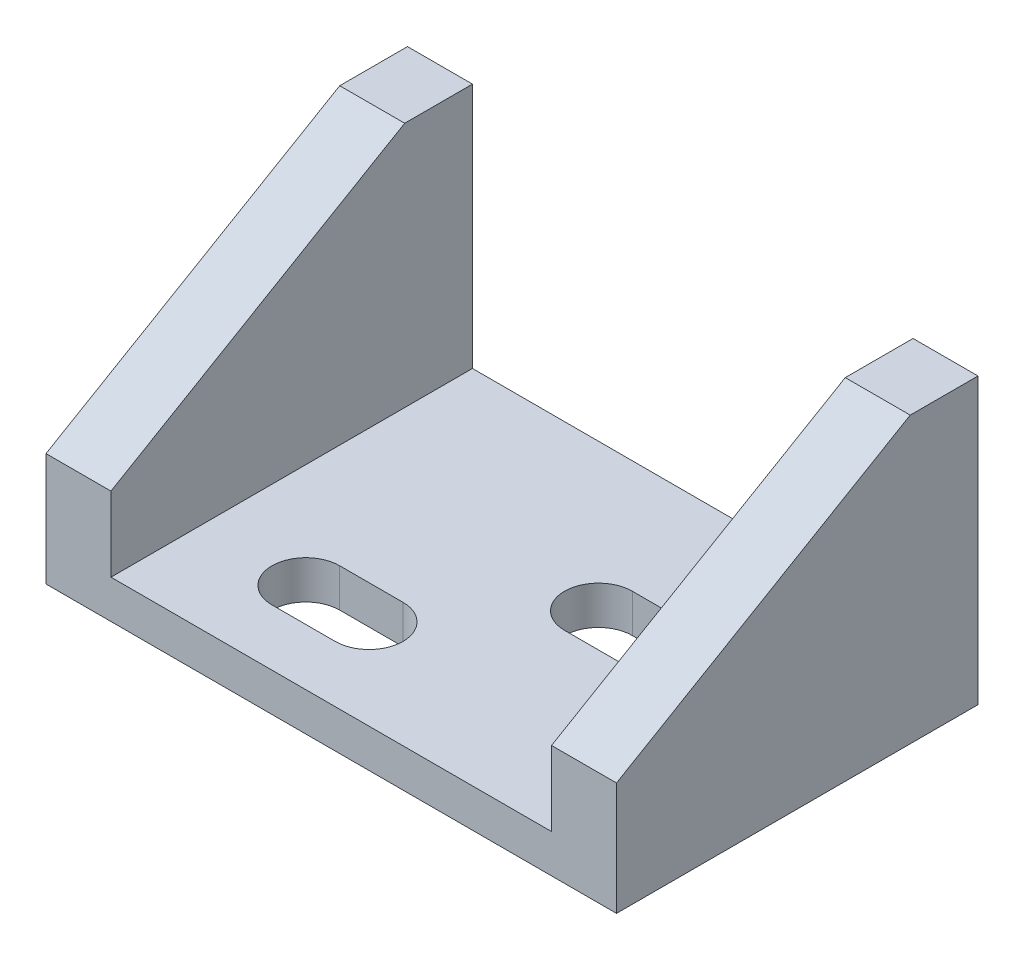
ISO-10303-21;
HEADER;
FILE_DESCRIPTION(('STEP AP214'),'2;1');
FILE_NAME('part.step','',(''),(''),'','','');
FILE_SCHEMA(('AUTOMOTIVE_DESIGN { 1 0 10303 214 1 1 1 1 }'));
ENDSEC;
DATA;
#1=APPLICATION_CONTEXT('core data for automotive mechanical design processes');
#2=APPLICATION_PROTOCOL_DEFINITION('international standard','automotive_design',2000,#1);
#3=PRODUCT_CONTEXT('',#1,'mechanical');
#4=PRODUCT('Part','Part','',(#3));
#5=PRODUCT_RELATED_PRODUCT_CATEGORY('part','',(#4));
#6=PRODUCT_DEFINITION_FORMATION('','',#4);
#7=PRODUCT_DEFINITION_CONTEXT('part definition',#1,'design');
#8=PRODUCT_DEFINITION('design','',#6,#7);
#9=PRODUCT_DEFINITION_SHAPE('','',#8);
#10=(LENGTH_UNIT() NAMED_UNIT(*) SI_UNIT(.MILLI.,.METRE.));
#11=(NAMED_UNIT(*) PLANE_ANGLE_UNIT() SI_UNIT($,.RADIAN.));
#12=(NAMED_UNIT(*) SI_UNIT($,.STERADIAN.) SOLID_ANGLE_UNIT());
#13=UNCERTAINTY_MEASURE_WITH_UNIT(LENGTH_MEASURE(1.E-05),#10,'distance_accuracy_value','');
#14=(GEOMETRIC_REPRESENTATION_CONTEXT(3) GLOBAL_UNCERTAINTY_ASSIGNED_CONTEXT((#13)) GLOBAL_UNIT_ASSIGNED_CONTEXT((#10,
#11,#12)) REPRESENTATION_CONTEXT('',''));
#15=CARTESIAN_POINT('',(0.,0.,0.));
#16=DIRECTION('',(0.,0.,1.));
#17=DIRECTION('',(1.,0.,0.));
#18=AXIS2_PLACEMENT_3D('',#15,#16,#17);
#19=CARTESIAN_POINT('',(0.,0.,0.));
#20=DIRECTION('',(0.,1.,0.));
#21=DIRECTION('',(0.,0.,1.));
#22=AXIS2_PLACEMENT_3D('',#19,#20,#21);
#23=PLANE('',#22);
#24=CARTESIAN_POINT('',(-5.125,0.,4.));
#25=DIRECTION('',(0.,1.,0.));
#26=DIRECTION('',(0.,0.,1.));
#27=AXIS2_PLACEMENT_3D('',#24,#25,#26);
#28=CIRCLE('',#27,1.5);
#29=CARTESIAN_POINT('',(-5.125,0.,2.5));
#30=VERTEX_POINT('',#29);
#31=CARTESIAN_POINT('',(-5.125,0.,5.5));
#32=VERTEX_POINT('',#31);
#33=EDGE_CURVE('E200',#30,#32,#28,.T.);
#34=ORIENTED_EDGE('',*,*,#33,.T.);
#35=DIRECTION('',(1.,0.,0.));
#36=VECTOR('',#35,1.);
#37=CARTESIAN_POINT('',(-5.125,0.,5.5));
#38=LINE('',#37,#36);
#39=CARTESIAN_POINT('',(-2.325,0.,5.5));
#40=VERTEX_POINT('',#39);
#41=EDGE_CURVE('E203',#32,#40,#38,.T.);
#42=ORIENTED_EDGE('',*,*,#41,.T.);
#43=CARTESIAN_POINT('',(-2.325,0.,4.));
#44=DIRECTION('',(0.,1.,0.));
#45=DIRECTION('',(0.,0.,1.));
#46=AXIS2_PLACEMENT_3D('',#43,#44,#45);
#47=CIRCLE('',#46,1.5);
#48=CARTESIAN_POINT('',(-2.325,0.,2.5));
#49=VERTEX_POINT('',#48);
#50=EDGE_CURVE('E206',#40,#49,#47,.T.);
#51=ORIENTED_EDGE('',*,*,#50,.T.);
#52=DIRECTION('',(-1.,0.,0.));
#53=VECTOR('',#52,1.);
#54=CARTESIAN_POINT('',(-5.125,0.,2.5));
#55=LINE('',#54,#53);
#56=EDGE_CURVE('E209',#49,#30,#55,.T.);
#57=ORIENTED_EDGE('',*,*,#56,.T.);
#58=EDGE_LOOP('',(#34,#42,#51,#57));
#59=FACE_BOUND('',#58,.T.);
#60=DIRECTION('',(0.,0.,1.));
#61=VECTOR('',#60,1.);
#62=CARTESIAN_POINT('',(-12.625,0.,-8.));
#63=LINE('',#62,#61);
#64=CARTESIAN_POINT('',(-12.625,0.,-8.));
#65=VERTEX_POINT('',#64);
#66=CARTESIAN_POINT('',(-12.625,0.,8.));
#67=VERTEX_POINT('',#66);
#68=EDGE_CURVE('E279',#65,#67,#63,.T.);
#69=ORIENTED_EDGE('',*,*,#68,.F.);
#70=DIRECTION('',(-1.,0.,0.));
#71=VECTOR('',#70,1.);
#72=CARTESIAN_POINT('',(-12.625,0.,-8.));
#73=LINE('',#72,#71);
#74=CARTESIAN_POINT('',(12.625,0.,-8.));
#75=VERTEX_POINT('',#74);
#76=EDGE_CURVE('E286',#75,#65,#73,.T.);
#77=ORIENTED_EDGE('',*,*,#76,.F.);
#78=DIRECTION('',(0.,0.,-1.));
#79=VECTOR('',#78,1.);
#80=CARTESIAN_POINT('',(12.625,0.,-8.));
#81=LINE('',#80,#79);
#82=CARTESIAN_POINT('',(12.625,0.,8.));
#83=VERTEX_POINT('',#82);
#84=EDGE_CURVE('E284',#83,#75,#81,.T.);
#85=ORIENTED_EDGE('',*,*,#84,.F.);
#86=DIRECTION('',(1.,0.,0.));
#87=VECTOR('',#86,1.);
#88=CARTESIAN_POINT('',(-12.625,0.,8.));
#89=LINE('',#88,#87);
#90=EDGE_CURVE('E282',#67,#83,#89,.T.);
#91=ORIENTED_EDGE('',*,*,#90,.F.);
#92=EDGE_LOOP('',(#69,#77,#85,#91));
#93=FACE_BOUND('',#92,.T.);
#94=CARTESIAN_POINT('',(2.325,0.,-1.5));
#95=DIRECTION('',(0.,1.,0.));
#96=DIRECTION('',(0.,0.,1.));
#97=AXIS2_PLACEMENT_3D('',#94,#95,#96);
#98=CIRCLE('',#97,1.5);
#99=CARTESIAN_POINT('',(2.325,0.,-3.));
#100=VERTEX_POINT('',#99);
#101=CARTESIAN_POINT('',(2.325,0.,0.));
#102=VERTEX_POINT('',#101);
#103=EDGE_CURVE('E48',#100,#102,#98,.T.);
#104=ORIENTED_EDGE('',*,*,#103,.T.);
#105=DIRECTION('',(1.,0.,0.));
#106=VECTOR('',#105,1.);
#107=CARTESIAN_POINT('',(2.325,0.,0.));
#108=LINE('',#107,#106);
#109=CARTESIAN_POINT('',(5.125,0.,0.));
#110=VERTEX_POINT('',#109);
#111=EDGE_CURVE('E176',#102,#110,#108,.T.);
#112=ORIENTED_EDGE('',*,*,#111,.T.);
#113=CARTESIAN_POINT('',(5.125,0.,-1.5));
#114=DIRECTION('',(0.,1.,0.));
#115=DIRECTION('',(0.,0.,1.));
#116=AXIS2_PLACEMENT_3D('',#113,#114,#115);
#117=CIRCLE('',#116,1.5);
#118=CARTESIAN_POINT('',(5.125,0.,-3.));
#119=VERTEX_POINT('',#118);
#120=EDGE_CURVE('E184',#110,#119,#117,.T.);
#121=ORIENTED_EDGE('',*,*,#120,.T.);
#122=DIRECTION('',(-1.,0.,0.));
#123=VECTOR('',#122,1.);
#124=CARTESIAN_POINT('',(2.325,0.,-3.));
#125=LINE('',#124,#123);
#126=EDGE_CURVE('E170',#119,#100,#125,.T.);
#127=ORIENTED_EDGE('',*,*,#126,.T.);
#128=EDGE_LOOP('',(#104,#112,#121,#127));
#129=FACE_BOUND('',#128,.T.);
#130=ADVANCED_FACE('F33',(#59,#93,#129),#23,.F.);
#131=CARTESIAN_POINT('',(-9.75,1.7,8.));
#132=DIRECTION('',(0.,-1.,0.));
#133=DIRECTION('',(0.,0.,-1.));
#134=AXIS2_PLACEMENT_3D('',#131,#132,#133);
#135=PLANE('',#134);
#136=CARTESIAN_POINT('',(-5.125,1.7,4.));
#137=DIRECTION('',(0.,-1.,0.));
#138=DIRECTION('',(0.,0.,-1.));
#139=AXIS2_PLACEMENT_3D('',#136,#137,#138);
#140=CIRCLE('',#139,1.5);
#141=CARTESIAN_POINT('',(-5.125,1.7,5.5));
#142=VERTEX_POINT('',#141);
#143=CARTESIAN_POINT('',(-5.125,1.7,2.5));
#144=VERTEX_POINT('',#143);
#145=EDGE_CURVE('E197',#142,#144,#140,.T.);
#146=ORIENTED_EDGE('',*,*,#145,.T.);
#147=DIRECTION('',(1.,0.,0.));
#148=VECTOR('',#147,1.);
#149=CARTESIAN_POINT('',(-5.125,1.7,2.5));
#150=LINE('',#149,#148);
#151=CARTESIAN_POINT('',(-2.325,1.7,2.5));
#152=VERTEX_POINT('',#151);
#153=EDGE_CURVE('E221',#144,#152,#150,.T.);
#154=ORIENTED_EDGE('',*,*,#153,.T.);
#155=CARTESIAN_POINT('',(-2.325,1.7,4.));
#156=DIRECTION('',(0.,-1.,0.));
#157=DIRECTION('',(0.,0.,-1.));
#158=AXIS2_PLACEMENT_3D('',#155,#156,#157);
#159=CIRCLE('',#158,1.5);
#160=CARTESIAN_POINT('',(-2.325,1.7,5.5));
#161=VERTEX_POINT('',#160);
#162=EDGE_CURVE('E164',#152,#161,#159,.T.);
#163=ORIENTED_EDGE('',*,*,#162,.T.);
#164=DIRECTION('',(-1.,0.,0.));
#165=VECTOR('',#164,1.);
#166=CARTESIAN_POINT('',(-5.125,1.7,5.5));
#167=LINE('',#166,#165);
#168=EDGE_CURVE('E194',#161,#142,#167,.T.);
#169=ORIENTED_EDGE('',*,*,#168,.T.);
#170=EDGE_LOOP('',(#146,#154,#163,#169));
#171=FACE_BOUND('',#170,.T.);
#172=DIRECTION('',(0.,0.,-1.));
#173=VECTOR('',#172,1.);
#174=CARTESIAN_POINT('',(9.75,1.7,8.));
#175=LINE('',#174,#173);
#176=CARTESIAN_POINT('',(9.75,1.7,8.));
#177=VERTEX_POINT('',#176);
#178=CARTESIAN_POINT('',(9.75,1.7,-8.));
#179=VERTEX_POINT('',#178);
#180=EDGE_CURVE('E241',#177,#179,#175,.T.);
#181=ORIENTED_EDGE('',*,*,#180,.T.);
#182=DIRECTION('',(1.,0.,0.));
#183=VECTOR('',#182,1.);
#184=CARTESIAN_POINT('',(-9.75,1.7,-8.));
#185=LINE('',#184,#183);
#186=CARTESIAN_POINT('',(-9.75,1.7,-8.));
#187=VERTEX_POINT('',#186);
#188=EDGE_CURVE('E252',#187,#179,#185,.T.);
#189=ORIENTED_EDGE('',*,*,#188,.F.);
#190=DIRECTION('',(0.,0.,-1.));
#191=VECTOR('',#190,1.);
#192=CARTESIAN_POINT('',(-9.75,1.7,8.));
#193=LINE('',#192,#191);
#194=CARTESIAN_POINT('',(-9.75,1.7,8.));
#195=VERTEX_POINT('',#194);
#196=EDGE_CURVE('E228',#195,#187,#193,.T.);
#197=ORIENTED_EDGE('',*,*,#196,.F.);
#198=DIRECTION('',(1.,0.,0.));
#199=VECTOR('',#198,1.);
#200=CARTESIAN_POINT('',(-9.75,1.7,8.));
#201=LINE('',#200,#199);
#202=EDGE_CURVE('E238',#195,#177,#201,.T.);
#203=ORIENTED_EDGE('',*,*,#202,.T.);
#204=EDGE_LOOP('',(#181,#189,#197,#203));
#205=FACE_BOUND('',#204,.T.);
#206=CARTESIAN_POINT('',(2.325,1.7,-1.5));
#207=DIRECTION('',(0.,-1.,0.));
#208=DIRECTION('',(0.,0.,-1.));
#209=AXIS2_PLACEMENT_3D('',#206,#207,#208);
#210=CIRCLE('',#209,1.5);
#211=CARTESIAN_POINT('',(2.325,1.7,0.));
#212=VERTEX_POINT('',#211);
#213=CARTESIAN_POINT('',(2.325,1.7,-3.));
#214=VERTEX_POINT('',#213);
#215=EDGE_CURVE('E168',#212,#214,#210,.T.);
#216=ORIENTED_EDGE('',*,*,#215,.T.);
#217=DIRECTION('',(1.,0.,0.));
#218=VECTOR('',#217,1.);
#219=CARTESIAN_POINT('',(2.325,1.7,-3.));
#220=LINE('',#219,#218);
#221=CARTESIAN_POINT('',(5.125,1.7,-3.));
#222=VERTEX_POINT('',#221);
#223=EDGE_CURVE('E157',#214,#222,#220,.T.);
#224=ORIENTED_EDGE('',*,*,#223,.T.);
#225=CARTESIAN_POINT('',(5.125,1.7,-1.5));
#226=DIRECTION('',(0.,-1.,0.));
#227=DIRECTION('',(0.,0.,-1.));
#228=AXIS2_PLACEMENT_3D('',#225,#226,#227);
#229=CIRCLE('',#228,1.5);
#230=CARTESIAN_POINT('',(5.125,1.7,0.));
#231=VERTEX_POINT('',#230);
#232=EDGE_CURVE('E178',#222,#231,#229,.T.);
#233=ORIENTED_EDGE('',*,*,#232,.T.);
#234=DIRECTION('',(-1.,0.,0.));
#235=VECTOR('',#234,1.);
#236=CARTESIAN_POINT('',(2.325,1.7,0.));
#237=LINE('',#236,#235);
#238=EDGE_CURVE('E174',#231,#212,#237,.T.);
#239=ORIENTED_EDGE('',*,*,#238,.T.);
#240=EDGE_LOOP('',(#216,#224,#233,#239));
#241=FACE_BOUND('',#240,.T.);
#242=ADVANCED_FACE('F173',(#171,#205,#241),#135,.F.);
#243=CARTESIAN_POINT('',(12.625,12.6,-5.));
#244=DIRECTION('',(0.,-1.,0.));
#245=DIRECTION('',(0.,0.,-1.));
#246=AXIS2_PLACEMENT_3D('',#243,#244,#245);
#247=PLANE('',#246);
#248=DIRECTION('',(0.,0.,1.));
#249=VECTOR('',#248,1.);
#250=CARTESIAN_POINT('',(9.75,12.6,-5.));
#251=LINE('',#250,#249);
#252=CARTESIAN_POINT('',(9.75,12.6,-8.));
#253=VERTEX_POINT('',#252);
#254=CARTESIAN_POINT('',(9.75,12.6,-5.));
#255=VERTEX_POINT('',#254);
#256=EDGE_CURVE('E247',#253,#255,#251,.T.);
#257=ORIENTED_EDGE('',*,*,#256,.T.);
#258=DIRECTION('',(-1.,0.,0.));
#259=VECTOR('',#258,1.);
#260=CARTESIAN_POINT('',(12.625,12.6,-5.));
#261=LINE('',#260,#259);
#262=CARTESIAN_POINT('',(12.625,12.6,-5.));
#263=VERTEX_POINT('',#262);
#264=EDGE_CURVE('E272',#263,#255,#261,.T.);
#265=ORIENTED_EDGE('',*,*,#264,.F.);
#266=DIRECTION('',(0.,0.,1.));
#267=VECTOR('',#266,1.);
#268=CARTESIAN_POINT('',(12.625,12.6,-5.));
#269=LINE('',#268,#267);
#270=CARTESIAN_POINT('',(12.625,12.6,-8.));
#271=VERTEX_POINT('',#270);
#272=EDGE_CURVE('E257',#271,#263,#269,.T.);
#273=ORIENTED_EDGE('',*,*,#272,.F.);
#274=DIRECTION('',(-1.,0.,0.));
#275=VECTOR('',#274,1.);
#276=CARTESIAN_POINT('',(12.625,12.6,-8.));
#277=LINE('',#276,#275);
#278=EDGE_CURVE('E276',#271,#253,#277,.T.);
#279=ORIENTED_EDGE('',*,*,#278,.T.);
#280=EDGE_LOOP('',(#257,#265,#273,#279));
#281=FACE_BOUND('',#280,.T.);
#282=ADVANCED_FACE('F332',(#281),#247,.F.);
#283=CARTESIAN_POINT('',(12.625,5.,8.));
#284=DIRECTION('',(0.,-0.863296794119082,-0.504696587331156));
#285=DIRECTION('',(0.,0.504696587331156,-0.863296794119082));
#286=AXIS2_PLACEMENT_3D('',#283,#284,#285);
#287=PLANE('',#286);
#288=DIRECTION('',(0.,-0.504696587331156,0.863296794119082));
#289=VECTOR('',#288,1.);
#290=CARTESIAN_POINT('',(9.75,5.,8.));
#291=LINE('',#290,#289);
#292=CARTESIAN_POINT('',(9.75,5.,8.));
#293=VERTEX_POINT('',#292);
#294=EDGE_CURVE('E229',#255,#293,#291,.T.);
#295=ORIENTED_EDGE('',*,*,#294,.T.);
#296=DIRECTION('',(-1.,0.,0.));
#297=VECTOR('',#296,1.);
#298=CARTESIAN_POINT('',(12.625,5.,8.));
#299=LINE('',#298,#297);
#300=CARTESIAN_POINT('',(12.625,5.,8.));
#301=VERTEX_POINT('',#300);
#302=EDGE_CURVE('E268',#301,#293,#299,.T.);
#303=ORIENTED_EDGE('',*,*,#302,.F.);
#304=DIRECTION('',(0.,-0.504696587331156,0.863296794119082));
#305=VECTOR('',#304,1.);
#306=CARTESIAN_POINT('',(12.625,5.,8.));
#307=LINE('',#306,#305);
#308=EDGE_CURVE('E259',#263,#301,#307,.T.);
#309=ORIENTED_EDGE('',*,*,#308,.F.);
#310=ORIENTED_EDGE('',*,*,#264,.T.);
#311=EDGE_LOOP('',(#295,#303,#309,#310));
#312=FACE_BOUND('',#311,.T.);
#313=ADVANCED_FACE('F329',(#312),#287,.F.);
#314=CARTESIAN_POINT('',(-12.625,1.7,-8.));
#315=DIRECTION('',(1.,0.,0.));
#316=DIRECTION('',(0.,0.,-1.));
#317=AXIS2_PLACEMENT_3D('',#314,#315,#316);
#318=PLANE('',#317);
#319=ORIENTED_EDGE('',*,*,#68,.T.);
#320=DIRECTION('',(0.,-1.,0.));
#321=VECTOR('',#320,1.);
#322=CARTESIAN_POINT('',(-12.625,1.7,8.));
#323=LINE('',#322,#321);
#324=CARTESIAN_POINT('',(-12.625,5.,8.));
#325=VERTEX_POINT('',#324);
#326=EDGE_CURVE('E11',#325,#67,#323,.T.);
#327=ORIENTED_EDGE('',*,*,#326,.F.);
#328=DIRECTION('',(0.,-0.504696587331156,0.863296794119082));
#329=VECTOR('',#328,1.);
#330=CARTESIAN_POINT('',(-12.625,5.,8.));
#331=LINE('',#330,#329);
#332=CARTESIAN_POINT('',(-12.625,12.6,-5.));
#333=VERTEX_POINT('',#332);
#334=EDGE_CURVE('E260',#333,#325,#331,.T.);
#335=ORIENTED_EDGE('',*,*,#334,.F.);
#336=DIRECTION('',(0.,0.,1.));
#337=VECTOR('',#336,1.);
#338=CARTESIAN_POINT('',(-12.625,12.6,-5.));
#339=LINE('',#338,#337);
#340=CARTESIAN_POINT('',(-12.625,12.6,-8.));
#341=VERTEX_POINT('',#340);
#342=EDGE_CURVE('E255',#341,#333,#339,.T.);
#343=ORIENTED_EDGE('',*,*,#342,.F.);
#344=DIRECTION('',(0.,-1.,0.));
#345=VECTOR('',#344,1.);
#346=CARTESIAN_POINT('',(-12.625,1.7,-8.));
#347=LINE('',#346,#345);
#348=EDGE_CURVE('E288',#341,#65,#347,.T.);
#349=ORIENTED_EDGE('',*,*,#348,.T.);
#350=EDGE_LOOP('',(#319,#327,#335,#343,#349));
#351=FACE_BOUND('',#350,.T.);
#352=ADVANCED_FACE('F35',(#351),#318,.F.);
#353=CARTESIAN_POINT('',(-12.625,1.7,8.));
#354=DIRECTION('',(0.,0.,-1.));
#355=DIRECTION('',(-1.,0.,0.));
#356=AXIS2_PLACEMENT_3D('',#353,#354,#355);
#357=PLANE('',#356);
#358=ORIENTED_EDGE('',*,*,#202,.F.);
#359=DIRECTION('',(0.,-1.,0.));
#360=VECTOR('',#359,1.);
#361=CARTESIAN_POINT('',(-9.75,1.7,8.));
#362=LINE('',#361,#360);
#363=CARTESIAN_POINT('',(-9.75,5.,8.));
#364=VERTEX_POINT('',#363);
#365=EDGE_CURVE('E225',#364,#195,#362,.T.);
#366=ORIENTED_EDGE('',*,*,#365,.F.);
#367=EDGE_CURVE('E263',#364,#325,#299,.T.);
#368=ORIENTED_EDGE('',*,*,#367,.T.);
#369=ORIENTED_EDGE('',*,*,#326,.T.);
#370=ORIENTED_EDGE('',*,*,#90,.T.);
#371=DIRECTION('',(0.,-1.,0.));
#372=VECTOR('',#371,1.);
#373=CARTESIAN_POINT('',(12.625,1.7,8.));
#374=LINE('',#373,#372);
#375=EDGE_CURVE('E41',#301,#83,#374,.T.);
#376=ORIENTED_EDGE('',*,*,#375,.F.);
#377=ORIENTED_EDGE('',*,*,#302,.T.);
#378=DIRECTION('',(0.,-1.,0.));
#379=VECTOR('',#378,1.);
#380=CARTESIAN_POINT('',(9.75,1.7,8.));
#381=LINE('',#380,#379);
#382=EDGE_CURVE('E224',#293,#177,#381,.T.);
#383=ORIENTED_EDGE('',*,*,#382,.T.);
#384=EDGE_LOOP('',(#358,#366,#368,#369,#370,#376,#377,#383));
#385=FACE_BOUND('',#384,.T.);
#386=ADVANCED_FACE('F327',(#385),#357,.F.);
#387=CARTESIAN_POINT('',(12.625,1.7,-8.));
#388=DIRECTION('',(-1.,0.,0.));
#389=DIRECTION('',(0.,0.,1.));
#390=AXIS2_PLACEMENT_3D('',#387,#388,#389);
#391=PLANE('',#390);
#392=ORIENTED_EDGE('',*,*,#84,.T.);
#393=DIRECTION('',(0.,-1.,0.));
#394=VECTOR('',#393,1.);
#395=CARTESIAN_POINT('',(12.625,1.7,-8.));
#396=LINE('',#395,#394);
#397=EDGE_CURVE('E291',#271,#75,#396,.T.);
#398=ORIENTED_EDGE('',*,*,#397,.F.);
#399=ORIENTED_EDGE('',*,*,#272,.T.);
#400=ORIENTED_EDGE('',*,*,#308,.T.);
#401=ORIENTED_EDGE('',*,*,#375,.T.);
#402=EDGE_LOOP('',(#392,#398,#399,#400,#401));
#403=FACE_BOUND('',#402,.T.);
#404=ADVANCED_FACE('F296',(#403),#391,.F.);
#405=CARTESIAN_POINT('',(-12.625,1.7,-8.));
#406=DIRECTION('',(0.,0.,1.));
#407=DIRECTION('',(1.,0.,0.));
#408=AXIS2_PLACEMENT_3D('',#405,#406,#407);
#409=PLANE('',#408);
#410=CARTESIAN_POINT('',(-9.75,12.6,-8.));
#411=VERTEX_POINT('',#410);
#412=EDGE_CURVE('E275',#411,#341,#277,.T.);
#413=ORIENTED_EDGE('',*,*,#412,.F.);
#414=DIRECTION('',(0.,1.,0.));
#415=VECTOR('',#414,1.);
#416=CARTESIAN_POINT('',(-9.75,1.7,-8.));
#417=LINE('',#416,#415);
#418=EDGE_CURVE('E232',#187,#411,#417,.T.);
#419=ORIENTED_EDGE('',*,*,#418,.F.);
#420=ORIENTED_EDGE('',*,*,#188,.T.);
#421=DIRECTION('',(0.,1.,0.));
#422=VECTOR('',#421,1.);
#423=CARTESIAN_POINT('',(9.75,1.7,-8.));
#424=LINE('',#423,#422);
#425=EDGE_CURVE('E244',#179,#253,#424,.T.);
#426=ORIENTED_EDGE('',*,*,#425,.T.);
#427=ORIENTED_EDGE('',*,*,#278,.F.);
#428=ORIENTED_EDGE('',*,*,#397,.T.);
#429=ORIENTED_EDGE('',*,*,#76,.T.);
#430=ORIENTED_EDGE('',*,*,#348,.F.);
#431=EDGE_LOOP('',(#413,#419,#420,#426,#427,#428,#429,#430));
#432=FACE_BOUND('',#431,.T.);
#433=ADVANCED_FACE('F307',(#432),#409,.F.);
#434=CARTESIAN_POINT('',(-9.75,12.6,-5.));
#435=VERTEX_POINT('',#434);
#436=EDGE_CURVE('E271',#435,#333,#261,.T.);
#437=ORIENTED_EDGE('',*,*,#436,.F.);
#438=DIRECTION('',(0.,0.,1.));
#439=VECTOR('',#438,1.);
#440=CARTESIAN_POINT('',(-9.75,12.6,-5.));
#441=LINE('',#440,#439);
#442=EDGE_CURVE('E234',#411,#435,#441,.T.);
#443=ORIENTED_EDGE('',*,*,#442,.F.);
#444=ORIENTED_EDGE('',*,*,#412,.T.);
#445=ORIENTED_EDGE('',*,*,#342,.T.);
#446=EDGE_LOOP('',(#437,#443,#444,#445));
#447=FACE_BOUND('',#446,.T.);
#448=ADVANCED_FACE('F315',(#447),#247,.F.);
#449=ORIENTED_EDGE('',*,*,#367,.F.);
#450=DIRECTION('',(0.,-0.504696587331156,0.863296794119082));
#451=VECTOR('',#450,1.);
#452=CARTESIAN_POINT('',(-9.75,5.,8.));
#453=LINE('',#452,#451);
#454=EDGE_CURVE('E236',#435,#364,#453,.T.);
#455=ORIENTED_EDGE('',*,*,#454,.F.);
#456=ORIENTED_EDGE('',*,*,#436,.T.);
#457=ORIENTED_EDGE('',*,*,#334,.T.);
#458=EDGE_LOOP('',(#449,#455,#456,#457));
#459=FACE_BOUND('',#458,.T.);
#460=ADVANCED_FACE('F341',(#459),#287,.F.);
#461=CARTESIAN_POINT('',(-9.75,0.,0.));
#462=DIRECTION('',(-1.,0.,0.));
#463=DIRECTION('',(0.,0.,1.));
#464=AXIS2_PLACEMENT_3D('',#461,#462,#463);
#465=PLANE('',#464);
#466=ORIENTED_EDGE('',*,*,#365,.T.);
#467=ORIENTED_EDGE('',*,*,#196,.T.);
#468=ORIENTED_EDGE('',*,*,#418,.T.);
#469=ORIENTED_EDGE('',*,*,#442,.T.);
#470=ORIENTED_EDGE('',*,*,#454,.T.);
#471=EDGE_LOOP('',(#466,#467,#468,#469,#470));
#472=FACE_BOUND('',#471,.T.);
#473=ADVANCED_FACE('F319',(#472),#465,.F.);
#474=CARTESIAN_POINT('',(9.75,0.,0.));
#475=DIRECTION('',(-1.,0.,0.));
#476=DIRECTION('',(0.,0.,1.));
#477=AXIS2_PLACEMENT_3D('',#474,#475,#476);
#478=PLANE('',#477);
#479=ORIENTED_EDGE('',*,*,#382,.F.);
#480=ORIENTED_EDGE('',*,*,#294,.F.);
#481=ORIENTED_EDGE('',*,*,#256,.F.);
#482=ORIENTED_EDGE('',*,*,#425,.F.);
#483=ORIENTED_EDGE('',*,*,#180,.F.);
#484=EDGE_LOOP('',(#479,#480,#481,#482,#483));
#485=FACE_BOUND('',#484,.T.);
#486=ADVANCED_FACE('F326',(#485),#478,.T.);
#487=CARTESIAN_POINT('',(-5.125,12.601,4.));
#488=DIRECTION('',(0.,-1.,0.));
#489=DIRECTION('',(0.,0.,-1.));
#490=AXIS2_PLACEMENT_3D('',#487,#488,#489);
#491=CYLINDRICAL_SURFACE('',#490,1.5);
#492=DIRECTION('',(0.,-1.,0.));
#493=VECTOR('',#492,1.);
#494=CARTESIAN_POINT('',(-5.125,12.601,5.5));
#495=LINE('',#494,#493);
#496=EDGE_CURVE('E219',#142,#32,#495,.T.);
#497=ORIENTED_EDGE('',*,*,#496,.T.);
#498=ORIENTED_EDGE('',*,*,#33,.F.);
#499=DIRECTION('',(0.,-1.,0.));
#500=VECTOR('',#499,1.);
#501=CARTESIAN_POINT('',(-5.125,12.601,2.5));
#502=LINE('',#501,#500);
#503=EDGE_CURVE('E212',#144,#30,#502,.T.);
#504=ORIENTED_EDGE('',*,*,#503,.F.);
#505=ORIENTED_EDGE('',*,*,#145,.F.);
#506=EDGE_LOOP('',(#497,#498,#504,#505));
#507=FACE_BOUND('',#506,.T.);
#508=ADVANCED_FACE('F410',(#507),#491,.F.);
#509=CARTESIAN_POINT('',(-5.125,12.601,5.5));
#510=DIRECTION('',(0.,0.,-1.));
#511=DIRECTION('',(-1.,0.,0.));
#512=AXIS2_PLACEMENT_3D('',#509,#510,#511);
#513=PLANE('',#512);
#514=DIRECTION('',(0.,-1.,0.));
#515=VECTOR('',#514,1.);
#516=CARTESIAN_POINT('',(-2.325,12.601,5.5));
#517=LINE('',#516,#515);
#518=EDGE_CURVE('E217',#161,#40,#517,.T.);
#519=ORIENTED_EDGE('',*,*,#518,.T.);
#520=ORIENTED_EDGE('',*,*,#41,.F.);
#521=ORIENTED_EDGE('',*,*,#496,.F.);
#522=ORIENTED_EDGE('',*,*,#168,.F.);
#523=EDGE_LOOP('',(#519,#520,#521,#522));
#524=FACE_BOUND('',#523,.T.);
#525=ADVANCED_FACE('F430',(#524),#513,.T.);
#526=CARTESIAN_POINT('',(-2.325,12.601,4.));
#527=DIRECTION('',(0.,-1.,0.));
#528=DIRECTION('',(0.,0.,-1.));
#529=AXIS2_PLACEMENT_3D('',#526,#527,#528);
#530=CYLINDRICAL_SURFACE('',#529,1.5);
#531=DIRECTION('',(0.,-1.,0.));
#532=VECTOR('',#531,1.);
#533=CARTESIAN_POINT('',(-2.325,12.601,2.5));
#534=LINE('',#533,#532);
#535=EDGE_CURVE('E215',#152,#49,#534,.T.);
#536=ORIENTED_EDGE('',*,*,#535,.T.);
#537=ORIENTED_EDGE('',*,*,#50,.F.);
#538=ORIENTED_EDGE('',*,*,#518,.F.);
#539=ORIENTED_EDGE('',*,*,#162,.F.);
#540=EDGE_LOOP('',(#536,#537,#538,#539));
#541=FACE_BOUND('',#540,.T.);
#542=ADVANCED_FACE('F440',(#541),#530,.F.);
#543=CARTESIAN_POINT('',(-5.125,12.601,2.5));
#544=DIRECTION('',(0.,0.,1.));
#545=DIRECTION('',(1.,0.,0.));
#546=AXIS2_PLACEMENT_3D('',#543,#544,#545);
#547=PLANE('',#546);
#548=ORIENTED_EDGE('',*,*,#503,.T.);
#549=ORIENTED_EDGE('',*,*,#56,.F.);
#550=ORIENTED_EDGE('',*,*,#535,.F.);
#551=ORIENTED_EDGE('',*,*,#153,.F.);
#552=EDGE_LOOP('',(#548,#549,#550,#551));
#553=FACE_BOUND('',#552,.T.);
#554=ADVANCED_FACE('F450',(#553),#547,.T.);
#555=CARTESIAN_POINT('',(2.325,12.601,-1.5));
#556=DIRECTION('',(0.,-1.,0.));
#557=DIRECTION('',(0.,0.,-1.));
#558=AXIS2_PLACEMENT_3D('',#555,#556,#557);
#559=CYLINDRICAL_SURFACE('',#558,1.5);
#560=DIRECTION('',(0.,-1.,0.));
#561=VECTOR('',#560,1.);
#562=CARTESIAN_POINT('',(2.325,12.601,0.));
#563=LINE('',#562,#561);
#564=EDGE_CURVE('E165',#212,#102,#563,.T.);
#565=ORIENTED_EDGE('',*,*,#564,.T.);
#566=ORIENTED_EDGE('',*,*,#103,.F.);
#567=DIRECTION('',(0.,-1.,0.));
#568=VECTOR('',#567,1.);
#569=CARTESIAN_POINT('',(2.325,12.601,-3.));
#570=LINE('',#569,#568);
#571=EDGE_CURVE('E159',#214,#100,#570,.T.);
#572=ORIENTED_EDGE('',*,*,#571,.F.);
#573=ORIENTED_EDGE('',*,*,#215,.F.);
#574=EDGE_LOOP('',(#565,#566,#572,#573));
#575=FACE_BOUND('',#574,.T.);
#576=ADVANCED_FACE('F167',(#575),#559,.F.);
#577=CARTESIAN_POINT('',(2.325,12.601,0.));
#578=DIRECTION('',(0.,0.,-1.));
#579=DIRECTION('',(-1.,0.,0.));
#580=AXIS2_PLACEMENT_3D('',#577,#578,#579);
#581=PLANE('',#580);
#582=DIRECTION('',(0.,-1.,0.));
#583=VECTOR('',#582,1.);
#584=CARTESIAN_POINT('',(5.125,12.601,0.));
#585=LINE('',#584,#583);
#586=EDGE_CURVE('E189',#231,#110,#585,.T.);
#587=ORIENTED_EDGE('',*,*,#586,.T.);
#588=ORIENTED_EDGE('',*,*,#111,.F.);
#589=ORIENTED_EDGE('',*,*,#564,.F.);
#590=ORIENTED_EDGE('',*,*,#238,.F.);
#591=EDGE_LOOP('',(#587,#588,#589,#590));
#592=FACE_BOUND('',#591,.T.);
#593=ADVANCED_FACE('F469',(#592),#581,.T.);
#594=CARTESIAN_POINT('',(5.125,12.601,-1.5));
#595=DIRECTION('',(0.,-1.,0.));
#596=DIRECTION('',(0.,0.,-1.));
#597=AXIS2_PLACEMENT_3D('',#594,#595,#596);
#598=CYLINDRICAL_SURFACE('',#597,1.5);
#599=DIRECTION('',(0.,-1.,0.));
#600=VECTOR('',#599,1.);
#601=CARTESIAN_POINT('',(5.125,12.601,-3.));
#602=LINE('',#601,#600);
#603=EDGE_CURVE('E56',#222,#119,#602,.T.);
#604=ORIENTED_EDGE('',*,*,#603,.T.);
#605=ORIENTED_EDGE('',*,*,#120,.F.);
#606=ORIENTED_EDGE('',*,*,#586,.F.);
#607=ORIENTED_EDGE('',*,*,#232,.F.);
#608=EDGE_LOOP('',(#604,#605,#606,#607));
#609=FACE_BOUND('',#608,.T.);
#610=ADVANCED_FACE('F478',(#609),#598,.F.);
#611=CARTESIAN_POINT('',(2.325,12.601,-3.));
#612=DIRECTION('',(0.,0.,1.));
#613=DIRECTION('',(1.,0.,0.));
#614=AXIS2_PLACEMENT_3D('',#611,#612,#613);
#615=PLANE('',#614);
#616=ORIENTED_EDGE('',*,*,#571,.T.);
#617=ORIENTED_EDGE('',*,*,#126,.F.);
#618=ORIENTED_EDGE('',*,*,#603,.F.);
#619=ORIENTED_EDGE('',*,*,#223,.F.);
#620=EDGE_LOOP('',(#616,#617,#618,#619));
#621=FACE_BOUND('',#620,.T.);
#622=ADVANCED_FACE('F158',(#621),#615,.T.);
#623=CLOSED_SHELL('',(#130,#242,#282,#313,#352,#386,#404,#433,#448,#460,#473,#486,#508,#525,
#542,#554,#576,#593,#610,#622));
#624=MANIFOLD_SOLID_BREP('B2',#623);
#625=ADVANCED_BREP_SHAPE_REPRESENTATION('',(#18,#624),#14);
#626=SHAPE_DEFINITION_REPRESENTATION(#9,#625);
ENDSEC;
END-ISO-10303-21;
